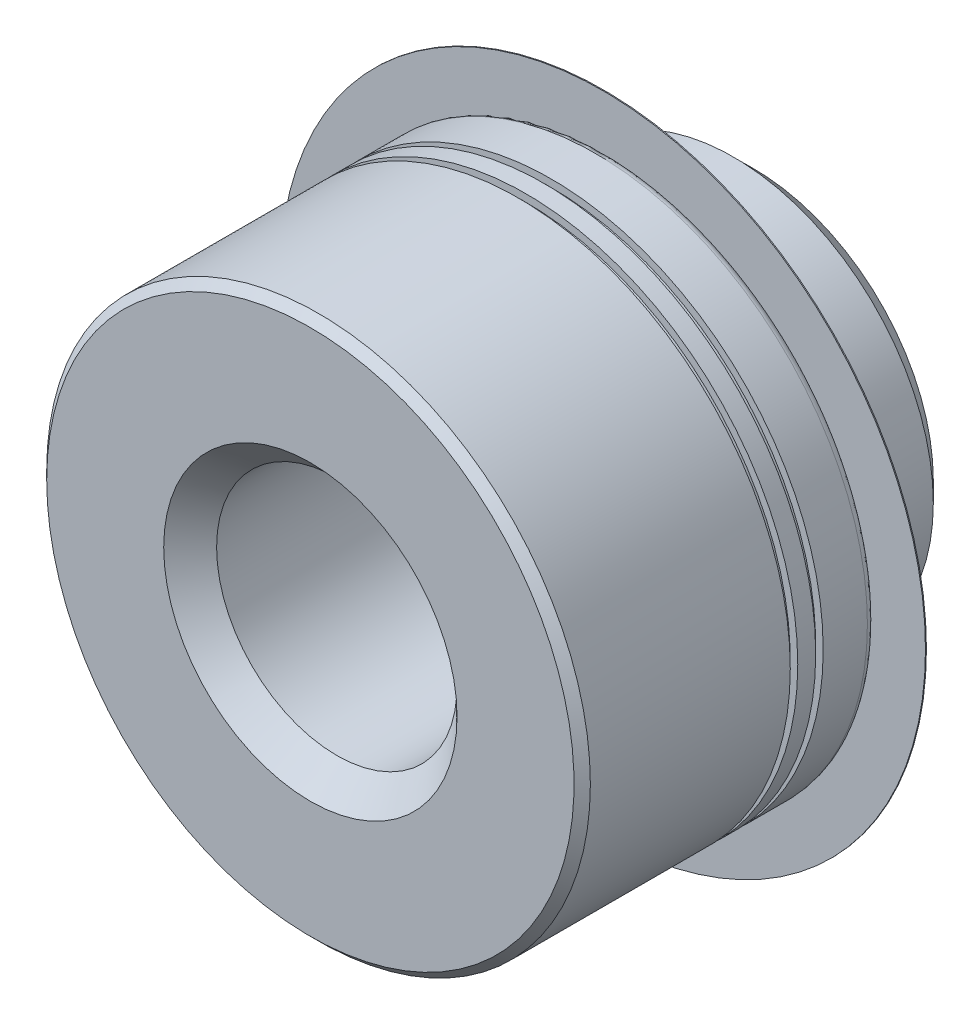
ISO-10303-21;
HEADER;
FILE_DESCRIPTION(('STEP AP214'),'2;1');
FILE_NAME('part.step','',(''),(''),'','','');
FILE_SCHEMA(('AUTOMOTIVE_DESIGN { 1 0 10303 214 1 1 1 1 }'));
ENDSEC;
DATA;
#1=APPLICATION_CONTEXT('core data for automotive mechanical design processes');
#2=APPLICATION_PROTOCOL_DEFINITION('international standard','automotive_design',2000,#1);
#3=PRODUCT_CONTEXT('',#1,'mechanical');
#4=PRODUCT('Part','Part','',(#3));
#5=PRODUCT_RELATED_PRODUCT_CATEGORY('part','',(#4));
#6=PRODUCT_DEFINITION_FORMATION('','',#4);
#7=PRODUCT_DEFINITION_CONTEXT('part definition',#1,'design');
#8=PRODUCT_DEFINITION('design','',#6,#7);
#9=PRODUCT_DEFINITION_SHAPE('','',#8);
#10=(LENGTH_UNIT() NAMED_UNIT(*) SI_UNIT(.MILLI.,.METRE.));
#11=(NAMED_UNIT(*) PLANE_ANGLE_UNIT() SI_UNIT($,.RADIAN.));
#12=(NAMED_UNIT(*) SI_UNIT($,.STERADIAN.) SOLID_ANGLE_UNIT());
#13=UNCERTAINTY_MEASURE_WITH_UNIT(LENGTH_MEASURE(1.E-05),#10,'distance_accuracy_value','');
#14=(GEOMETRIC_REPRESENTATION_CONTEXT(3) GLOBAL_UNCERTAINTY_ASSIGNED_CONTEXT((#13)) GLOBAL_UNIT_ASSIGNED_CONTEXT((#10,
#11,#12)) REPRESENTATION_CONTEXT('',''));
#15=CARTESIAN_POINT('',(0.,0.,0.));
#16=DIRECTION('',(0.,0.,1.));
#17=DIRECTION('',(1.,0.,0.));
#18=AXIS2_PLACEMENT_3D('',#15,#16,#17);
#19=CARTESIAN_POINT('',(0.,0.,0.833849999999992));
#20=DIRECTION('',(0.,0.,-1.));
#21=DIRECTION('',(-1.,0.,0.));
#22=AXIS2_PLACEMENT_3D('',#19,#20,#21);
#23=CYLINDRICAL_SURFACE('',#22,2.7034999999996);
#24=CARTESIAN_POINT('',(0.,0.,0.795600000000018));
#25=DIRECTION('',(0.,0.,-1.));
#26=DIRECTION('',(-1.,0.,0.));
#27=AXIS2_PLACEMENT_3D('',#24,#25,#26);
#28=CIRCLE('',#27,2.7034999999996);
#29=CARTESIAN_POINT('',(-2.7034999999996,0.,0.795600000000018));
#30=VERTEX_POINT('',#29);
#31=EDGE_CURVE('E71',#30,#30,#28,.T.);
#32=ORIENTED_EDGE('',*,*,#31,.F.);
#33=EDGE_LOOP('',(#32));
#34=FACE_BOUND('',#33,.T.);
#35=CARTESIAN_POINT('',(0.,0.,0.872099999999966));
#36=DIRECTION('',(0.,0.,-1.));
#37=DIRECTION('',(-1.,0.,0.));
#38=AXIS2_PLACEMENT_3D('',#35,#36,#37);
#39=CIRCLE('',#38,2.7034999999996);
#40=CARTESIAN_POINT('',(-2.7034999999996,0.,0.872099999999966));
#41=VERTEX_POINT('',#40);
#42=EDGE_CURVE('E18',#41,#41,#39,.F.);
#43=ORIENTED_EDGE('',*,*,#42,.F.);
#44=EDGE_LOOP('',(#43));
#45=FACE_BOUND('',#44,.T.);
#46=ADVANCED_FACE('F15',(#34,#45),#23,.T.);
#47=CARTESIAN_POINT('',(2.74174999999932,0.,0.872099999999966));
#48=DIRECTION('',(0.,0.,-1.));
#49=DIRECTION('',(-1.,0.,0.));
#50=AXIS2_PLACEMENT_3D('',#47,#48,#49);
#51=PLANE('',#50);
#52=ORIENTED_EDGE('',*,*,#42,.T.);
#53=EDGE_LOOP('',(#52));
#54=FACE_BOUND('',#53,.T.);
#55=CARTESIAN_POINT('',(0.,0.,0.872099999999966));
#56=DIRECTION('',(0.,0.,-1.));
#57=DIRECTION('',(-1.,0.,0.));
#58=AXIS2_PLACEMENT_3D('',#55,#56,#57);
#59=CIRCLE('',#58,2.77999999999904);
#60=CARTESIAN_POINT('',(-2.77999999999904,0.,0.872099999999966));
#61=VERTEX_POINT('',#60);
#62=EDGE_CURVE('E69',#61,#61,#59,.F.);
#63=ORIENTED_EDGE('',*,*,#62,.F.);
#64=EDGE_LOOP('',(#63));
#65=FACE_BOUND('',#64,.T.);
#66=ADVANCED_FACE('F78',(#54,#65),#51,.T.);
#67=CARTESIAN_POINT('',(2.74174999999932,0.,0.795600000000018));
#68=DIRECTION('',(0.,0.,1.));
#69=DIRECTION('',(1.,0.,0.));
#70=AXIS2_PLACEMENT_3D('',#67,#68,#69);
#71=PLANE('',#70);
#72=ORIENTED_EDGE('',*,*,#31,.T.);
#73=EDGE_LOOP('',(#72));
#74=FACE_BOUND('',#73,.T.);
#75=CARTESIAN_POINT('',(0.,0.,0.795600000000018));
#76=DIRECTION('',(0.,0.,-1.));
#77=DIRECTION('',(-1.,0.,0.));
#78=AXIS2_PLACEMENT_3D('',#75,#76,#77);
#79=CIRCLE('',#78,2.77999999999904);
#80=CARTESIAN_POINT('',(-2.77999999999904,0.,0.795600000000018));
#81=VERTEX_POINT('',#80);
#82=EDGE_CURVE('E66',#81,#81,#79,.T.);
#83=ORIENTED_EDGE('',*,*,#82,.F.);
#84=EDGE_LOOP('',(#83));
#85=FACE_BOUND('',#84,.T.);
#86=ADVANCED_FACE('F87',(#74,#85),#71,.T.);
#87=CARTESIAN_POINT('',(0.,0.,1.89435000000007));
#88=DIRECTION('',(0.,0.,-1.));
#89=DIRECTION('',(-1.,0.,0.));
#90=AXIS2_PLACEMENT_3D('',#87,#88,#89);
#91=CYLINDRICAL_SURFACE('',#90,2.77999999999904);
#92=ORIENTED_EDGE('',*,*,#62,.T.);
#93=EDGE_LOOP('',(#92));
#94=FACE_BOUND('',#93,.T.);
#95=CARTESIAN_POINT('',(0.,0.,2.91660000004867));
#96=DIRECTION('',(0.,0.,-1.));
#97=DIRECTION('',(1.,0.,0.));
#98=AXIS2_PLACEMENT_3D('',#95,#96,#97);
#99=CIRCLE('',#98,2.77999999997292);
#100=CARTESIAN_POINT('',(2.77999999997292,0.,2.91660000004867));
#101=VERTEX_POINT('',#100);
#102=EDGE_CURVE('E30',#101,#101,#99,.F.);
#103=ORIENTED_EDGE('',*,*,#102,.F.);
#104=EDGE_LOOP('',(#103));
#105=FACE_BOUND('',#104,.T.);
#106=ADVANCED_FACE('F183',(#94,#105),#91,.T.);
#107=CARTESIAN_POINT('',(0.,0.,0.703799999999928));
#108=DIRECTION('',(0.,0.,-1.));
#109=DIRECTION('',(-1.,0.,0.));
#110=AXIS2_PLACEMENT_3D('',#107,#108,#109);
#111=CYLINDRICAL_SURFACE('',#110,2.77999999999904);
#112=CARTESIAN_POINT('',(0.,0.,0.612000000000092));
#113=DIRECTION('',(0.,0.,-1.));
#114=DIRECTION('',(-1.,0.,0.));
#115=AXIS2_PLACEMENT_3D('',#112,#113,#114);
#116=CIRCLE('',#115,2.77999999999904);
#117=CARTESIAN_POINT('',(-2.77999999999904,0.,0.612000000000092));
#118=VERTEX_POINT('',#117);
#119=EDGE_CURVE('E63',#118,#118,#116,.T.);
#120=ORIENTED_EDGE('',*,*,#119,.F.);
#121=EDGE_LOOP('',(#120));
#122=FACE_BOUND('',#121,.T.);
#123=ORIENTED_EDGE('',*,*,#82,.T.);
#124=EDGE_LOOP('',(#123));
#125=FACE_BOUND('',#124,.T.);
#126=ADVANCED_FACE('F179',(#122,#125),#111,.T.);
#127=CARTESIAN_POINT('',(0.,0.,2.91660000004867));
#128=DIRECTION('',(0.,0.,-1.));
#129=DIRECTION('',(-1.,0.,0.));
#130=AXIS2_PLACEMENT_3D('',#127,#128,#129);
#131=CONICAL_SURFACE('',#130,2.77999999997292,0.785398163397448);
#132=ORIENTED_EDGE('',*,*,#102,.T.);
#133=EDGE_LOOP('',(#132));
#134=FACE_BOUND('',#133,.T.);
#135=CARTESIAN_POINT('',(0.,0.,2.9999999999859));
#136=DIRECTION('',(0.,0.,-1.));
#137=DIRECTION('',(-1.,0.,0.));
#138=AXIS2_PLACEMENT_3D('',#135,#136,#137);
#139=CIRCLE('',#138,2.69660000003569);
#140=CARTESIAN_POINT('',(-2.69660000003569,0.,2.9999999999859));
#141=VERTEX_POINT('',#140);
#142=EDGE_CURVE('E60',#141,#141,#139,.F.);
#143=ORIENTED_EDGE('',*,*,#142,.F.);
#144=EDGE_LOOP('',(#143));
#145=FACE_BOUND('',#144,.T.);
#146=ADVANCED_FACE('F175',(#134,#145),#131,.T.);
#147=CARTESIAN_POINT('',(2.74174999999932,0.,0.612000000000092));
#148=DIRECTION('',(0.,0.,-1.));
#149=DIRECTION('',(-1.,0.,0.));
#150=AXIS2_PLACEMENT_3D('',#147,#148,#149);
#151=PLANE('',#150);
#152=CARTESIAN_POINT('',(0.,0.,0.612000000000092));
#153=DIRECTION('',(0.,0.,-1.));
#154=DIRECTION('',(-1.,0.,0.));
#155=AXIS2_PLACEMENT_3D('',#152,#153,#154);
#156=CIRCLE('',#155,2.7034999999996);
#157=CARTESIAN_POINT('',(-2.7034999999996,0.,0.612000000000092));
#158=VERTEX_POINT('',#157);
#159=EDGE_CURVE('E57',#158,#158,#156,.T.);
#160=ORIENTED_EDGE('',*,*,#159,.F.);
#161=EDGE_LOOP('',(#160));
#162=FACE_BOUND('',#161,.T.);
#163=ORIENTED_EDGE('',*,*,#119,.T.);
#164=EDGE_LOOP('',(#163));
#165=FACE_BOUND('',#164,.T.);
#166=ADVANCED_FACE('F171',(#162,#165),#151,.T.);
#167=CARTESIAN_POINT('',(1.34829999999989,0.,3.0000000000007));
#168=DIRECTION('',(0.,0.,1.));
#169=DIRECTION('',(1.,0.,0.));
#170=AXIS2_PLACEMENT_3D('',#167,#168,#169);
#171=PLANE('',#170);
#172=CARTESIAN_POINT('',(0.,0.,2.9999999999859));
#173=DIRECTION('',(0.,0.,1.));
#174=DIRECTION('',(0.,-1.,0.));
#175=AXIS2_PLACEMENT_3D('',#172,#173,#174);
#176=CIRCLE('',#175,1.49999999996453);
#177=CARTESIAN_POINT('',(0.,-1.49999999996453,2.9999999999859));
#178=VERTEX_POINT('',#177);
#179=EDGE_CURVE('E54',#178,#178,#176,.F.);
#180=ORIENTED_EDGE('',*,*,#179,.T.);
#181=EDGE_LOOP('',(#180));
#182=FACE_BOUND('',#181,.T.);
#183=ORIENTED_EDGE('',*,*,#142,.T.);
#184=EDGE_LOOP('',(#183));
#185=FACE_BOUND('',#184,.T.);
#186=ADVANCED_FACE('F167',(#182,#185),#171,.T.);
#187=CARTESIAN_POINT('',(0.,0.,0.573750000000118));
#188=DIRECTION('',(0.,0.,-1.));
#189=DIRECTION('',(-1.,0.,0.));
#190=AXIS2_PLACEMENT_3D('',#187,#188,#189);
#191=CYLINDRICAL_SURFACE('',#190,2.7034999999996);
#192=CARTESIAN_POINT('',(0.,0.,0.53549999999989));
#193=DIRECTION('',(0.,0.,-1.));
#194=DIRECTION('',(-1.,0.,0.));
#195=AXIS2_PLACEMENT_3D('',#192,#193,#194);
#196=CIRCLE('',#195,2.7034999999996);
#197=CARTESIAN_POINT('',(-2.7034999999996,0.,0.53549999999989));
#198=VERTEX_POINT('',#197);
#199=EDGE_CURVE('E51',#198,#198,#196,.T.);
#200=ORIENTED_EDGE('',*,*,#199,.F.);
#201=EDGE_LOOP('',(#200));
#202=FACE_BOUND('',#201,.T.);
#203=ORIENTED_EDGE('',*,*,#159,.T.);
#204=EDGE_LOOP('',(#203));
#205=FACE_BOUND('',#204,.T.);
#206=ADVANCED_FACE('F163',(#202,#205),#191,.T.);
#207=CARTESIAN_POINT('',(0.,0.,2.99999999987222));
#208=DIRECTION('',(0.,0.,1.));
#209=DIRECTION('',(0.,-1.,0.));
#210=AXIS2_PLACEMENT_3D('',#207,#208,#209);
#211=CONICAL_SURFACE('',#210,1.49999999985084,0.785398163397448);
#212=ORIENTED_EDGE('',*,*,#179,.F.);
#213=EDGE_LOOP('',(#212));
#214=FACE_BOUND('',#213,.T.);
#215=CARTESIAN_POINT('',(0.,0.,2.72950000000102));
#216=DIRECTION('',(0.,0.,-1.));
#217=DIRECTION('',(-1.,0.,0.));
#218=AXIS2_PLACEMENT_3D('',#215,#216,#217);
#219=CIRCLE('',#218,1.22949999999991);
#220=CARTESIAN_POINT('',(-1.22949999999991,0.,2.72950000000102));
#221=VERTEX_POINT('',#220);
#222=EDGE_CURVE('E50',#221,#221,#219,.T.);
#223=ORIENTED_EDGE('',*,*,#222,.T.);
#224=EDGE_LOOP('',(#223));
#225=FACE_BOUND('',#224,.T.);
#226=ADVANCED_FACE('F131',(#214,#225),#211,.F.);
#227=CARTESIAN_POINT('',(2.74174999999932,0.,0.53549999999989));
#228=DIRECTION('',(0.,0.,1.));
#229=DIRECTION('',(1.,0.,0.));
#230=AXIS2_PLACEMENT_3D('',#227,#228,#229);
#231=PLANE('',#230);
#232=ORIENTED_EDGE('',*,*,#199,.T.);
#233=EDGE_LOOP('',(#232));
#234=FACE_BOUND('',#233,.T.);
#235=CARTESIAN_POINT('',(0.,0.,0.53549999999989));
#236=DIRECTION('',(0.,0.,-1.));
#237=DIRECTION('',(-1.,0.,0.));
#238=AXIS2_PLACEMENT_3D('',#235,#236,#237);
#239=CIRCLE('',#238,2.77999999999904);
#240=CARTESIAN_POINT('',(-2.77999999999904,0.,0.53549999999989));
#241=VERTEX_POINT('',#240);
#242=EDGE_CURVE('E46',#241,#241,#239,.T.);
#243=ORIENTED_EDGE('',*,*,#242,.F.);
#244=EDGE_LOOP('',(#243));
#245=FACE_BOUND('',#244,.T.);
#246=ADVANCED_FACE('F137',(#234,#245),#231,.T.);
#247=CARTESIAN_POINT('',(0.,0.,0.735000000000108));
#248=DIRECTION('',(0.,0.,-1.));
#249=DIRECTION('',(-1.,0.,0.));
#250=AXIS2_PLACEMENT_3D('',#247,#248,#249);
#251=CYLINDRICAL_SURFACE('',#250,1.22949999999991);
#252=ORIENTED_EDGE('',*,*,#222,.F.);
#253=EDGE_LOOP('',(#252));
#254=FACE_BOUND('',#253,.T.);
#255=CARTESIAN_POINT('',(0.,0.,-1.2595000000033));
#256=DIRECTION('',(0.,0.,-1.));
#257=DIRECTION('',(1.,0.,0.));
#258=AXIS2_PLACEMENT_3D('',#255,#256,#257);
#259=CIRCLE('',#258,1.22949999996536);
#260=CARTESIAN_POINT('',(1.22949999996536,0.,-1.2595000000033));
#261=VERTEX_POINT('',#260);
#262=EDGE_CURVE('E49',#261,#261,#259,.T.);
#263=ORIENTED_EDGE('',*,*,#262,.T.);
#264=EDGE_LOOP('',(#263));
#265=FACE_BOUND('',#264,.T.);
#266=ADVANCED_FACE('F133',(#254,#265),#251,.F.);
#267=CARTESIAN_POINT('',(0.,0.,0.309449999999956));
#268=DIRECTION('',(0.,0.,-1.));
#269=DIRECTION('',(-1.,0.,0.));
#270=AXIS2_PLACEMENT_3D('',#267,#268,#269);
#271=CYLINDRICAL_SURFACE('',#270,2.77999999999904);
#272=ORIENTED_EDGE('',*,*,#242,.T.);
#273=EDGE_LOOP('',(#272));
#274=FACE_BOUND('',#273,.T.);
#275=CARTESIAN_POINT('',(0.,0.,0.0833999999999966));
#276=DIRECTION('',(0.,0.,-1.));
#277=DIRECTION('',(-1.,0.,0.));
#278=AXIS2_PLACEMENT_3D('',#275,#276,#277);
#279=CIRCLE('',#278,2.77999999999978);
#280=CARTESIAN_POINT('',(-2.77999999999978,0.,0.0833999999999966));
#281=VERTEX_POINT('',#280);
#282=EDGE_CURVE('E45',#281,#281,#279,.T.);
#283=ORIENTED_EDGE('',*,*,#282,.F.);
#284=EDGE_LOOP('',(#283));
#285=FACE_BOUND('',#284,.T.);
#286=ADVANCED_FACE('F136',(#274,#285),#271,.T.);
#287=CARTESIAN_POINT('',(0.,0.,-1.52999999994563));
#288=DIRECTION('',(0.,0.,-1.));
#289=DIRECTION('',(0.,1.,0.));
#290=AXIS2_PLACEMENT_3D('',#287,#288,#289);
#291=CONICAL_SURFACE('',#290,1.49999999990769,0.785398163397448);
#292=ORIENTED_EDGE('',*,*,#262,.F.);
#293=EDGE_LOOP('',(#292));
#294=FACE_BOUND('',#293,.T.);
#295=CARTESIAN_POINT('',(0.,0.,-1.53000000000247));
#296=DIRECTION('',(0.,0.,-1.));
#297=DIRECTION('',(0.,1.,0.));
#298=AXIS2_PLACEMENT_3D('',#295,#296,#297);
#299=CIRCLE('',#298,1.49999999996453);
#300=CARTESIAN_POINT('',(0.,1.49999999996453,-1.53000000000247));
#301=VERTEX_POINT('',#300);
#302=EDGE_CURVE('E42',#301,#301,#299,.F.);
#303=ORIENTED_EDGE('',*,*,#302,.F.);
#304=EDGE_LOOP('',(#303));
#305=FACE_BOUND('',#304,.T.);
#306=ADVANCED_FACE('F119',(#294,#305),#291,.F.);
#307=CARTESIAN_POINT('',(0.,0.,0.0833999999999966));
#308=DIRECTION('',(0.,0.,-1.));
#309=DIRECTION('',(-1.,0.,0.));
#310=AXIS2_PLACEMENT_3D('',#307,#308,#309);
#311=TOROIDAL_SURFACE('',#310,2.69659999999978,0.0833999999999966);
#312=ORIENTED_EDGE('',*,*,#282,.T.);
#313=EDGE_LOOP('',(#312));
#314=FACE_BOUND('',#313,.T.);
#315=CARTESIAN_POINT('',(0.,0.,0.0100000000000006));
#316=DIRECTION('',(0.,0.,-1.));
#317=DIRECTION('',(-1.,0.,0.));
#318=AXIS2_PLACEMENT_3D('',#315,#316,#317);
#319=CIRCLE('',#318,2.73619797974623);
#320=CARTESIAN_POINT('',(-2.73619797974623,0.,0.0100000000000006));
#321=VERTEX_POINT('',#320);
#322=EDGE_CURVE('E39',#321,#321,#319,.T.);
#323=ORIENTED_EDGE('',*,*,#322,.F.);
#324=EDGE_LOOP('',(#323));
#325=FACE_BOUND('',#324,.T.);
#326=ADVANCED_FACE('F114',(#314,#325),#311,.T.);
#327=CARTESIAN_POINT('',(0.920250000000002,0.,-1.52999999999998));
#328=DIRECTION('',(0.,0.,-1.));
#329=DIRECTION('',(-1.,0.,0.));
#330=AXIS2_PLACEMENT_3D('',#327,#328,#329);
#331=PLANE('',#330);
#332=ORIENTED_EDGE('',*,*,#302,.T.);
#333=EDGE_LOOP('',(#332));
#334=FACE_BOUND('',#333,.T.);
#335=CARTESIAN_POINT('',(0.,0.,-1.53000000000247));
#336=DIRECTION('',(0.,0.,1.));
#337=DIRECTION('',(1.,0.,0.));
#338=AXIS2_PLACEMENT_3D('',#335,#336,#337);
#339=CIRCLE('',#338,1.8404999999575);
#340=CARTESIAN_POINT('',(1.8404999999575,0.,-1.53000000000247));
#341=VERTEX_POINT('',#340);
#342=EDGE_CURVE('E36',#341,#341,#339,.T.);
#343=ORIENTED_EDGE('',*,*,#342,.F.);
#344=EDGE_LOOP('',(#343));
#345=FACE_BOUND('',#344,.T.);
#346=ADVANCED_FACE('F110',(#334,#345),#331,.T.);
#347=CARTESIAN_POINT('',(0.,0.,0.0100000000000006));
#348=DIRECTION('',(0.,0.,1.));
#349=DIRECTION('',(1.,0.,0.));
#350=AXIS2_PLACEMENT_3D('',#347,#348,#349);
#351=PLANE('',#350);
#352=ORIENTED_EDGE('',*,*,#322,.T.);
#353=EDGE_LOOP('',(#352));
#354=FACE_BOUND('',#353,.T.);
#355=CARTESIAN_POINT('',(1.01509902017814E-05,0.,0.0100000000000006));
#356=DIRECTION('',(0.,0.,1.));
#357=DIRECTION('',(1.,0.,0.));
#358=AXIS2_PLACEMENT_3D('',#355,#356,#357);
#359=CIRCLE('',#358,3.30037870247806);
#360=CARTESIAN_POINT('',(3.30038885346826,0.,0.0100000000000006));
#361=VERTEX_POINT('',#360);
#362=EDGE_CURVE('E33',#361,#361,#359,.F.);
#363=ORIENTED_EDGE('',*,*,#362,.F.);
#364=EDGE_LOOP('',(#363));
#365=FACE_BOUND('',#364,.T.);
#366=ADVANCED_FACE('F106',(#354,#365),#351,.T.);
#367=CARTESIAN_POINT('',(0.,0.,-1.3255000000072));
#368=DIRECTION('',(0.,0.,1.));
#369=DIRECTION('',(1.,0.,0.));
#370=AXIS2_PLACEMENT_3D('',#367,#368,#369);
#371=CONICAL_SURFACE('',#370,2.04499999995278,0.785398163397448);
#372=ORIENTED_EDGE('',*,*,#342,.T.);
#373=EDGE_LOOP('',(#372));
#374=FACE_BOUND('',#373,.T.);
#375=CARTESIAN_POINT('',(0.,0.,-1.32550000000003));
#376=DIRECTION('',(0.,0.,-1.));
#377=DIRECTION('',(-1.,0.,0.));
#378=AXIS2_PLACEMENT_3D('',#375,#376,#377);
#379=CIRCLE('',#378,2.04499999999995);
#380=CARTESIAN_POINT('',(-2.04499999999995,0.,-1.32550000000003));
#381=VERTEX_POINT('',#380);
#382=EDGE_CURVE('E27',#381,#381,#379,.F.);
#383=ORIENTED_EDGE('',*,*,#382,.F.);
#384=EDGE_LOOP('',(#383));
#385=FACE_BOUND('',#384,.T.);
#386=ADVANCED_FACE('F102',(#374,#385),#371,.T.);
#387=CARTESIAN_POINT('',(1.01509902017814E-05,0.,0.));
#388=DIRECTION('',(0.,0.,1.));
#389=DIRECTION('',(1.,0.,0.));
#390=AXIS2_PLACEMENT_3D('',#387,#388,#389);
#391=CYLINDRICAL_SURFACE('',#390,3.30037870247806);
#392=ORIENTED_EDGE('',*,*,#362,.T.);
#393=EDGE_LOOP('',(#392));
#394=FACE_BOUND('',#393,.T.);
#395=CARTESIAN_POINT('',(1.01509902017814E-05,0.,0.));
#396=DIRECTION('',(0.,0.,1.));
#397=DIRECTION('',(1.,0.,0.));
#398=AXIS2_PLACEMENT_3D('',#395,#396,#397);
#399=CIRCLE('',#398,3.30037870247806);
#400=CARTESIAN_POINT('',(3.30038885346826,0.,0.));
#401=VERTEX_POINT('',#400);
#402=EDGE_CURVE('E22',#401,#401,#399,.F.);
#403=ORIENTED_EDGE('',*,*,#402,.F.);
#404=EDGE_LOOP('',(#403));
#405=FACE_BOUND('',#404,.T.);
#406=ADVANCED_FACE('F95',(#394,#405),#391,.T.);
#407=CARTESIAN_POINT('',(0.,0.,-0.662750000000016));
#408=DIRECTION('',(0.,0.,-1.));
#409=DIRECTION('',(-1.,0.,0.));
#410=AXIS2_PLACEMENT_3D('',#407,#408,#409);
#411=CYLINDRICAL_SURFACE('',#410,2.04499999999995);
#412=ORIENTED_EDGE('',*,*,#382,.T.);
#413=EDGE_LOOP('',(#412));
#414=FACE_BOUND('',#413,.T.);
#415=CARTESIAN_POINT('',(0.,0.,0.));
#416=DIRECTION('',(0.,0.,-1.));
#417=DIRECTION('',(-1.,0.,0.));
#418=AXIS2_PLACEMENT_3D('',#415,#416,#417);
#419=CIRCLE('',#418,2.04499999999995);
#420=CARTESIAN_POINT('',(-2.04499999999995,0.,0.));
#421=VERTEX_POINT('',#420);
#422=EDGE_CURVE('E10',#421,#421,#419,.F.);
#423=ORIENTED_EDGE('',*,*,#422,.F.);
#424=EDGE_LOOP('',(#423));
#425=FACE_BOUND('',#424,.T.);
#426=ADVANCED_FACE('F90',(#414,#425),#411,.T.);
#427=CARTESIAN_POINT('',(2.37080000000012,0.,0.));
#428=DIRECTION('',(0.,0.,-1.));
#429=DIRECTION('',(-1.,0.,0.));
#430=AXIS2_PLACEMENT_3D('',#427,#428,#429);
#431=PLANE('',#430);
#432=ORIENTED_EDGE('',*,*,#422,.T.);
#433=EDGE_LOOP('',(#432));
#434=FACE_BOUND('',#433,.T.);
#435=ORIENTED_EDGE('',*,*,#402,.T.);
#436=EDGE_LOOP('',(#435));
#437=FACE_BOUND('',#436,.T.);
#438=ADVANCED_FACE('F88',(#434,#437),#431,.T.);
#439=CLOSED_SHELL('',(#46,#66,#86,#106,#126,#146,#166,#186,#206,#226,#246,#266,#286,#306,#326,
#346,#366,#386,#406,#426,#438));
#440=MANIFOLD_SOLID_BREP('B1',#439);
#441=ADVANCED_BREP_SHAPE_REPRESENTATION('',(#18,#440),#14);
#442=SHAPE_DEFINITION_REPRESENTATION(#9,#441);
ENDSEC;
END-ISO-10303-21;
